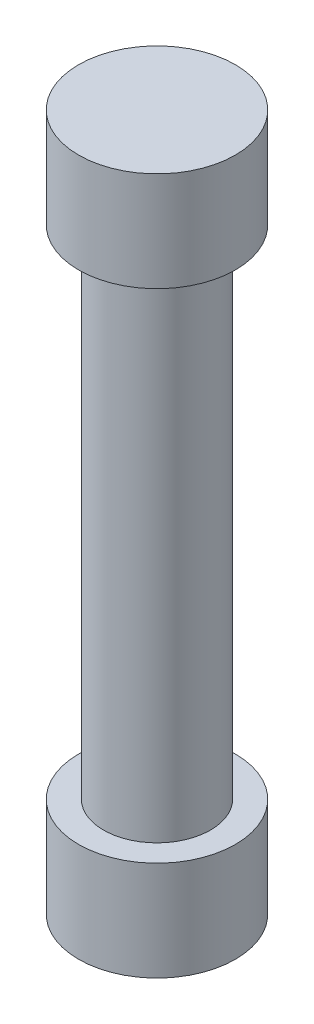
ISO-10303-21;
HEADER;
FILE_DESCRIPTION(('STEP AP214'),'2;1');
FILE_NAME('part.step','',(''),(''),'','','');
FILE_SCHEMA(('AUTOMOTIVE_DESIGN { 1 0 10303 214 1 1 1 1 }'));
ENDSEC;
DATA;
#1=APPLICATION_CONTEXT('core data for automotive mechanical design processes');
#2=APPLICATION_PROTOCOL_DEFINITION('international standard','automotive_design',2000,#1);
#3=PRODUCT_CONTEXT('',#1,'mechanical');
#4=PRODUCT('Part','Part','',(#3));
#5=PRODUCT_RELATED_PRODUCT_CATEGORY('part','',(#4));
#6=PRODUCT_DEFINITION_FORMATION('','',#4);
#7=PRODUCT_DEFINITION_CONTEXT('part definition',#1,'design');
#8=PRODUCT_DEFINITION('design','',#6,#7);
#9=PRODUCT_DEFINITION_SHAPE('','',#8);
#10=(LENGTH_UNIT() NAMED_UNIT(*) SI_UNIT(.MILLI.,.METRE.));
#11=(NAMED_UNIT(*) PLANE_ANGLE_UNIT() SI_UNIT($,.RADIAN.));
#12=(NAMED_UNIT(*) SI_UNIT($,.STERADIAN.) SOLID_ANGLE_UNIT());
#13=UNCERTAINTY_MEASURE_WITH_UNIT(LENGTH_MEASURE(1.E-05),#10,'distance_accuracy_value','');
#14=(GEOMETRIC_REPRESENTATION_CONTEXT(3) GLOBAL_UNCERTAINTY_ASSIGNED_CONTEXT((#13)) GLOBAL_UNIT_ASSIGNED_CONTEXT((#10,
#11,#12)) REPRESENTATION_CONTEXT('',''));
#15=CARTESIAN_POINT('',(0.,0.,0.));
#16=DIRECTION('',(0.,0.,1.));
#17=DIRECTION('',(1.,0.,0.));
#18=AXIS2_PLACEMENT_3D('',#15,#16,#17);
#19=CARTESIAN_POINT('',(-3.15,0.,0.));
#20=DIRECTION('',(0.,1.,0.));
#21=DIRECTION('',(0.,0.,1.));
#22=AXIS2_PLACEMENT_3D('',#19,#20,#21);
#23=PLANE('',#22);
#24=CARTESIAN_POINT('',(0.,0.,0.));
#25=DIRECTION('',(0.,-1.,0.));
#26=DIRECTION('',(0.,0.,-1.));
#27=AXIS2_PLACEMENT_3D('',#24,#25,#26);
#28=CIRCLE('',#27,3.15);
#29=CARTESIAN_POINT('',(0.,0.,-3.15));
#30=VERTEX_POINT('',#29);
#31=EDGE_CURVE('E64',#30,#30,#28,.T.);
#32=ORIENTED_EDGE('',*,*,#31,.T.);
#33=EDGE_LOOP('',(#32));
#34=FACE_BOUND('',#33,.T.);
#35=ADVANCED_FACE('F37',(#34),#23,.F.);
#36=CARTESIAN_POINT('',(0.,28.,0.));
#37=DIRECTION('',(0.,-1.,0.));
#38=DIRECTION('',(0.,0.,-1.));
#39=AXIS2_PLACEMENT_3D('',#36,#37,#38);
#40=PLANE('',#39);
#41=CARTESIAN_POINT('',(0.,28.,0.));
#42=DIRECTION('',(0.,-1.,0.));
#43=DIRECTION('',(0.,0.,-1.));
#44=AXIS2_PLACEMENT_3D('',#41,#42,#43);
#45=CIRCLE('',#44,3.15);
#46=CARTESIAN_POINT('',(0.,28.,-3.15));
#47=VERTEX_POINT('',#46);
#48=EDGE_CURVE('E10',#47,#47,#45,.T.);
#49=ORIENTED_EDGE('',*,*,#48,.F.);
#50=EDGE_LOOP('',(#49));
#51=FACE_BOUND('',#50,.T.);
#52=ADVANCED_FACE('F95',(#51),#40,.F.);
#53=CARTESIAN_POINT('',(0.,0.,0.));
#54=DIRECTION('',(0.,-1.,0.));
#55=DIRECTION('',(0.,0.,-1.));
#56=AXIS2_PLACEMENT_3D('',#53,#54,#55);
#57=CYLINDRICAL_SURFACE('',#56,3.15);
#58=CARTESIAN_POINT('',(0.,24.,0.));
#59=DIRECTION('',(0.,-1.,0.));
#60=DIRECTION('',(0.,0.,-1.));
#61=AXIS2_PLACEMENT_3D('',#58,#59,#60);
#62=CIRCLE('',#61,3.15);
#63=CARTESIAN_POINT('',(0.,24.,-3.15));
#64=VERTEX_POINT('',#63);
#65=EDGE_CURVE('E44',#64,#64,#62,.T.);
#66=ORIENTED_EDGE('',*,*,#65,.F.);
#67=EDGE_LOOP('',(#66));
#68=FACE_BOUND('',#67,.T.);
#69=ORIENTED_EDGE('',*,*,#48,.T.);
#70=EDGE_LOOP('',(#69));
#71=FACE_BOUND('',#70,.T.);
#72=ADVANCED_FACE('F90',(#68,#71),#57,.T.);
#73=CARTESIAN_POINT('',(-3.15,24.,0.));
#74=DIRECTION('',(0.,1.,0.));
#75=DIRECTION('',(0.,0.,1.));
#76=AXIS2_PLACEMENT_3D('',#73,#74,#75);
#77=PLANE('',#76);
#78=CARTESIAN_POINT('',(0.,24.,0.));
#79=DIRECTION('',(0.,-1.,0.));
#80=DIRECTION('',(0.,0.,-1.));
#81=AXIS2_PLACEMENT_3D('',#78,#79,#80);
#82=CIRCLE('',#81,2.15);
#83=CARTESIAN_POINT('',(0.,24.,-2.15));
#84=VERTEX_POINT('',#83);
#85=EDGE_CURVE('E49',#84,#84,#82,.T.);
#86=ORIENTED_EDGE('',*,*,#85,.F.);
#87=EDGE_LOOP('',(#86));
#88=FACE_BOUND('',#87,.T.);
#89=ORIENTED_EDGE('',*,*,#65,.T.);
#90=EDGE_LOOP('',(#89));
#91=FACE_BOUND('',#90,.T.);
#92=ADVANCED_FACE('F85',(#88,#91),#77,.F.);
#93=CARTESIAN_POINT('',(0.,0.,0.));
#94=DIRECTION('',(0.,-1.,0.));
#95=DIRECTION('',(0.,0.,-1.));
#96=AXIS2_PLACEMENT_3D('',#93,#94,#95);
#97=CYLINDRICAL_SURFACE('',#96,2.15);
#98=CARTESIAN_POINT('',(0.,4.,0.));
#99=DIRECTION('',(0.,-1.,0.));
#100=DIRECTION('',(0.,0.,-1.));
#101=AXIS2_PLACEMENT_3D('',#98,#99,#100);
#102=CIRCLE('',#101,2.15);
#103=CARTESIAN_POINT('',(0.,4.,-2.15));
#104=VERTEX_POINT('',#103);
#105=EDGE_CURVE('E54',#104,#104,#102,.T.);
#106=ORIENTED_EDGE('',*,*,#105,.F.);
#107=EDGE_LOOP('',(#106));
#108=FACE_BOUND('',#107,.T.);
#109=ORIENTED_EDGE('',*,*,#85,.T.);
#110=EDGE_LOOP('',(#109));
#111=FACE_BOUND('',#110,.T.);
#112=ADVANCED_FACE('F79',(#108,#111),#97,.T.);
#113=CARTESIAN_POINT('',(-3.15,4.,0.));
#114=DIRECTION('',(0.,-1.,0.));
#115=DIRECTION('',(0.,0.,-1.));
#116=AXIS2_PLACEMENT_3D('',#113,#114,#115);
#117=PLANE('',#116);
#118=CARTESIAN_POINT('',(0.,4.,0.));
#119=DIRECTION('',(0.,-1.,0.));
#120=DIRECTION('',(0.,0.,-1.));
#121=AXIS2_PLACEMENT_3D('',#118,#119,#120);
#122=CIRCLE('',#121,3.15);
#123=CARTESIAN_POINT('',(0.,4.,-3.15));
#124=VERTEX_POINT('',#123);
#125=EDGE_CURVE('E60',#124,#124,#122,.T.);
#126=ORIENTED_EDGE('',*,*,#125,.F.);
#127=EDGE_LOOP('',(#126));
#128=FACE_BOUND('',#127,.T.);
#129=ORIENTED_EDGE('',*,*,#105,.T.);
#130=EDGE_LOOP('',(#129));
#131=FACE_BOUND('',#130,.T.);
#132=ADVANCED_FACE('F73',(#128,#131),#117,.F.);
#133=CARTESIAN_POINT('',(0.,0.,0.));
#134=DIRECTION('',(0.,-1.,0.));
#135=DIRECTION('',(0.,0.,-1.));
#136=AXIS2_PLACEMENT_3D('',#133,#134,#135);
#137=CYLINDRICAL_SURFACE('',#136,3.15);
#138=ORIENTED_EDGE('',*,*,#31,.F.);
#139=EDGE_LOOP('',(#138));
#140=FACE_BOUND('',#139,.T.);
#141=ORIENTED_EDGE('',*,*,#125,.T.);
#142=EDGE_LOOP('',(#141));
#143=FACE_BOUND('',#142,.T.);
#144=ADVANCED_FACE('F70',(#140,#143),#137,.T.);
#145=CLOSED_SHELL('',(#35,#52,#72,#92,#112,#132,#144));
#146=MANIFOLD_SOLID_BREP('B2',#145);
#147=ADVANCED_BREP_SHAPE_REPRESENTATION('',(#18,#146),#14);
#148=SHAPE_DEFINITION_REPRESENTATION(#9,#147);
ENDSEC;
END-ISO-10303-21;
